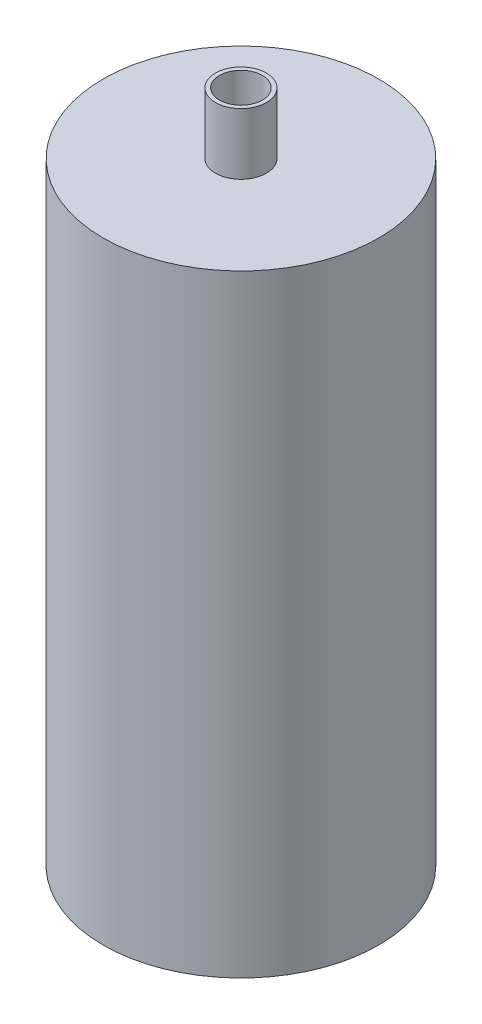
ISO-10303-21;
HEADER;
FILE_DESCRIPTION(('STEP AP214'),'2;1');
FILE_NAME('part.step','',(''),(''),'','','');
FILE_SCHEMA(('AUTOMOTIVE_DESIGN { 1 0 10303 214 1 1 1 1 }'));
ENDSEC;
DATA;
#1=APPLICATION_CONTEXT('core data for automotive mechanical design processes');
#2=APPLICATION_PROTOCOL_DEFINITION('international standard','automotive_design',2000,#1);
#3=PRODUCT_CONTEXT('',#1,'mechanical');
#4=PRODUCT('Part','Part','',(#3));
#5=PRODUCT_RELATED_PRODUCT_CATEGORY('part','',(#4));
#6=PRODUCT_DEFINITION_FORMATION('','',#4);
#7=PRODUCT_DEFINITION_CONTEXT('part definition',#1,'design');
#8=PRODUCT_DEFINITION('design','',#6,#7);
#9=PRODUCT_DEFINITION_SHAPE('','',#8);
#10=(LENGTH_UNIT() NAMED_UNIT(*) SI_UNIT(.MILLI.,.METRE.));
#11=(NAMED_UNIT(*) PLANE_ANGLE_UNIT() SI_UNIT($,.RADIAN.));
#12=(NAMED_UNIT(*) SI_UNIT($,.STERADIAN.) SOLID_ANGLE_UNIT());
#13=UNCERTAINTY_MEASURE_WITH_UNIT(LENGTH_MEASURE(1.E-05),#10,'distance_accuracy_value','');
#14=(GEOMETRIC_REPRESENTATION_CONTEXT(3) GLOBAL_UNCERTAINTY_ASSIGNED_CONTEXT((#13)) GLOBAL_UNIT_ASSIGNED_CONTEXT((#10,
#11,#12)) REPRESENTATION_CONTEXT('',''));
#15=CARTESIAN_POINT('',(0.,0.,0.));
#16=DIRECTION('',(0.,0.,1.));
#17=DIRECTION('',(1.,0.,0.));
#18=AXIS2_PLACEMENT_3D('',#15,#16,#17);
#19=CARTESIAN_POINT('',(0.,60.,0.));
#20=DIRECTION('',(0.,-1.,0.));
#21=DIRECTION('',(0.,0.,-1.));
#22=AXIS2_PLACEMENT_3D('',#19,#20,#21);
#23=CYLINDRICAL_SURFACE('',#22,13.5);
#24=CARTESIAN_POINT('',(0.,60.,0.));
#25=DIRECTION('',(0.,1.,0.));
#26=DIRECTION('',(0.,0.,1.));
#27=AXIS2_PLACEMENT_3D('',#24,#25,#26);
#28=CIRCLE('',#27,13.5);
#29=CARTESIAN_POINT('',(0.,60.,13.5));
#30=VERTEX_POINT('',#29);
#31=EDGE_CURVE('E38',#30,#30,#28,.T.);
#32=ORIENTED_EDGE('',*,*,#31,.F.);
#33=EDGE_LOOP('',(#32));
#34=FACE_BOUND('',#33,.T.);
#35=CARTESIAN_POINT('',(0.,0.,0.));
#36=DIRECTION('',(0.,1.,0.));
#37=DIRECTION('',(0.,0.,1.));
#38=AXIS2_PLACEMENT_3D('',#35,#36,#37);
#39=CIRCLE('',#38,13.5);
#40=CARTESIAN_POINT('',(0.,0.,13.5));
#41=VERTEX_POINT('',#40);
#42=EDGE_CURVE('E34',#41,#41,#39,.T.);
#43=ORIENTED_EDGE('',*,*,#42,.T.);
#44=EDGE_LOOP('',(#43));
#45=FACE_BOUND('',#44,.T.);
#46=ADVANCED_FACE('F31',(#34,#45),#23,.T.);
#47=CARTESIAN_POINT('',(0.,60.,0.));
#48=DIRECTION('',(0.,1.,0.));
#49=DIRECTION('',(0.,0.,1.));
#50=AXIS2_PLACEMENT_3D('',#47,#48,#49);
#51=PLANE('',#50);
#52=CARTESIAN_POINT('',(0.,60.,0.));
#53=DIRECTION('',(0.,1.,0.));
#54=DIRECTION('',(0.,0.,1.));
#55=AXIS2_PLACEMENT_3D('',#52,#53,#54);
#56=CIRCLE('',#55,2.5);
#57=CARTESIAN_POINT('',(0.,60.,2.5));
#58=VERTEX_POINT('',#57);
#59=EDGE_CURVE('E10',#58,#58,#56,.T.);
#60=ORIENTED_EDGE('',*,*,#59,.F.);
#61=EDGE_LOOP('',(#60));
#62=FACE_BOUND('',#61,.T.);
#63=ORIENTED_EDGE('',*,*,#31,.T.);
#64=EDGE_LOOP('',(#63));
#65=FACE_BOUND('',#64,.T.);
#66=ADVANCED_FACE('F75',(#62,#65),#51,.T.);
#67=CARTESIAN_POINT('',(0.,0.,0.));
#68=DIRECTION('',(0.,1.,0.));
#69=DIRECTION('',(0.,0.,1.));
#70=AXIS2_PLACEMENT_3D('',#67,#68,#69);
#71=PLANE('',#70);
#72=CARTESIAN_POINT('',(0.,0.,0.));
#73=DIRECTION('',(0.,1.,0.));
#74=DIRECTION('',(0.,0.,1.));
#75=AXIS2_PLACEMENT_3D('',#72,#73,#74);
#76=CIRCLE('',#75,2.1);
#77=CARTESIAN_POINT('',(0.,0.,2.1));
#78=VERTEX_POINT('',#77);
#79=EDGE_CURVE('E47',#78,#78,#76,.T.);
#80=ORIENTED_EDGE('',*,*,#79,.T.);
#81=EDGE_LOOP('',(#80));
#82=FACE_BOUND('',#81,.T.);
#83=ORIENTED_EDGE('',*,*,#42,.F.);
#84=EDGE_LOOP('',(#83));
#85=FACE_BOUND('',#84,.T.);
#86=ADVANCED_FACE('F54',(#82,#85),#71,.F.);
#87=CARTESIAN_POINT('',(0.,66.,0.));
#88=DIRECTION('',(0.,-1.,0.));
#89=DIRECTION('',(0.,0.,-1.));
#90=AXIS2_PLACEMENT_3D('',#87,#88,#89);
#91=CYLINDRICAL_SURFACE('',#90,2.5);
#92=CARTESIAN_POINT('',(0.,66.,0.));
#93=DIRECTION('',(0.,1.,0.));
#94=DIRECTION('',(0.,0.,1.));
#95=AXIS2_PLACEMENT_3D('',#92,#93,#94);
#96=CIRCLE('',#95,2.5);
#97=CARTESIAN_POINT('',(0.,66.,2.5));
#98=VERTEX_POINT('',#97);
#99=EDGE_CURVE('E44',#98,#98,#96,.T.);
#100=ORIENTED_EDGE('',*,*,#99,.F.);
#101=EDGE_LOOP('',(#100));
#102=FACE_BOUND('',#101,.T.);
#103=ORIENTED_EDGE('',*,*,#59,.T.);
#104=EDGE_LOOP('',(#103));
#105=FACE_BOUND('',#104,.T.);
#106=ADVANCED_FACE('F66',(#102,#105),#91,.T.);
#107=CARTESIAN_POINT('',(0.,66.,0.));
#108=DIRECTION('',(0.,1.,0.));
#109=DIRECTION('',(0.,0.,1.));
#110=AXIS2_PLACEMENT_3D('',#107,#108,#109);
#111=PLANE('',#110);
#112=CARTESIAN_POINT('',(0.,66.,0.));
#113=DIRECTION('',(0.,1.,0.));
#114=DIRECTION('',(0.,0.,1.));
#115=AXIS2_PLACEMENT_3D('',#112,#113,#114);
#116=CIRCLE('',#115,2.1);
#117=CARTESIAN_POINT('',(0.,66.,2.1));
#118=VERTEX_POINT('',#117);
#119=EDGE_CURVE('E48',#118,#118,#116,.T.);
#120=ORIENTED_EDGE('',*,*,#119,.F.);
#121=EDGE_LOOP('',(#120));
#122=FACE_BOUND('',#121,.T.);
#123=ORIENTED_EDGE('',*,*,#99,.T.);
#124=EDGE_LOOP('',(#123));
#125=FACE_BOUND('',#124,.T.);
#126=ADVANCED_FACE('F60',(#122,#125),#111,.T.);
#127=CARTESIAN_POINT('',(0.,0.,0.));
#128=DIRECTION('',(0.,1.,0.));
#129=DIRECTION('',(0.,0.,1.));
#130=AXIS2_PLACEMENT_3D('',#127,#128,#129);
#131=CYLINDRICAL_SURFACE('',#130,2.1);
#132=ORIENTED_EDGE('',*,*,#79,.F.);
#133=EDGE_LOOP('',(#132));
#134=FACE_BOUND('',#133,.T.);
#135=ORIENTED_EDGE('',*,*,#119,.T.);
#136=EDGE_LOOP('',(#135));
#137=FACE_BOUND('',#136,.T.);
#138=ADVANCED_FACE('F57',(#134,#137),#131,.F.);
#139=CLOSED_SHELL('',(#46,#66,#86,#106,#126,#138));
#140=MANIFOLD_SOLID_BREP('B2',#139);
#141=ADVANCED_BREP_SHAPE_REPRESENTATION('',(#18,#140),#14);
#142=SHAPE_DEFINITION_REPRESENTATION(#9,#141);
ENDSEC;
END-ISO-10303-21;
